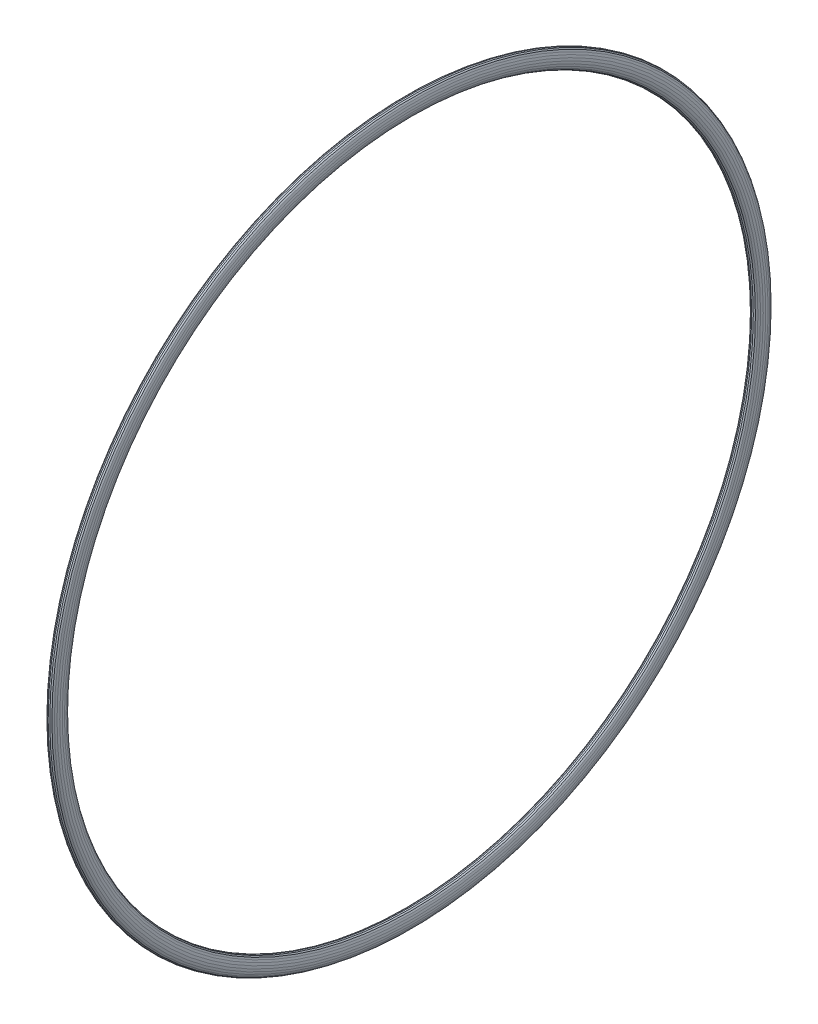
ISO-10303-21;
HEADER;
FILE_DESCRIPTION(('STEP AP214'),'2;1');
FILE_NAME('part.step','',(''),(''),'','','');
FILE_SCHEMA(('AUTOMOTIVE_DESIGN { 1 0 10303 214 1 1 1 1 }'));
ENDSEC;
DATA;
#1=APPLICATION_CONTEXT('core data for automotive mechanical design processes');
#2=APPLICATION_PROTOCOL_DEFINITION('international standard','automotive_design',2000,#1);
#3=PRODUCT_CONTEXT('',#1,'mechanical');
#4=PRODUCT('Part','Part','',(#3));
#5=PRODUCT_RELATED_PRODUCT_CATEGORY('part','',(#4));
#6=PRODUCT_DEFINITION_FORMATION('','',#4);
#7=PRODUCT_DEFINITION_CONTEXT('part definition',#1,'design');
#8=PRODUCT_DEFINITION('design','',#6,#7);
#9=PRODUCT_DEFINITION_SHAPE('','',#8);
#10=(LENGTH_UNIT() NAMED_UNIT(*) SI_UNIT(.MILLI.,.METRE.));
#11=(NAMED_UNIT(*) PLANE_ANGLE_UNIT() SI_UNIT($,.RADIAN.));
#12=(NAMED_UNIT(*) SI_UNIT($,.STERADIAN.) SOLID_ANGLE_UNIT());
#13=UNCERTAINTY_MEASURE_WITH_UNIT(LENGTH_MEASURE(1.E-05),#10,'distance_accuracy_value','');
#14=(GEOMETRIC_REPRESENTATION_CONTEXT(3) GLOBAL_UNCERTAINTY_ASSIGNED_CONTEXT((#13)) GLOBAL_UNIT_ASSIGNED_CONTEXT((#10,
#11,#12)) REPRESENTATION_CONTEXT('',''));
#15=CARTESIAN_POINT('',(0.,0.,0.));
#16=DIRECTION('',(0.,0.,1.));
#17=DIRECTION('',(1.,0.,0.));
#18=AXIS2_PLACEMENT_3D('',#15,#16,#17);
#19=CARTESIAN_POINT('',(-1.95500000000004,0.,0.));
#20=DIRECTION('',(-1.,0.,0.));
#21=DIRECTION('',(0.,0.,1.));
#22=AXIS2_PLACEMENT_3D('',#19,#20,#21);
#23=CONICAL_SURFACE('',#22,68.28,1.49799696442048);
#24=CARTESIAN_POINT('',(-1.92177768063184,0.,0.));
#25=DIRECTION('',(-1.,0.,0.));
#26=DIRECTION('',(0.,0.,1.));
#27=AXIS2_PLACEMENT_3D('',#24,#25,#26);
#28=CIRCLE('',#27,67.8244519350765);
#29=CARTESIAN_POINT('',(-1.92177768063184,0.,67.8244519350765));
#30=VERTEX_POINT('',#29);
#31=EDGE_CURVE('E113',#30,#30,#28,.T.);
#32=ORIENTED_EDGE('',*,*,#31,.F.);
#33=EDGE_LOOP('',(#32));
#34=FACE_BOUND('',#33,.T.);
#35=CARTESIAN_POINT('',(-1.95500000000004,0.,0.));
#36=DIRECTION('',(-1.,0.,0.));
#37=DIRECTION('',(0.,0.,1.));
#38=AXIS2_PLACEMENT_3D('',#35,#36,#37);
#39=CIRCLE('',#38,68.28);
#40=CARTESIAN_POINT('',(-1.95500000000004,0.,68.28));
#41=VERTEX_POINT('',#40);
#42=EDGE_CURVE('E10',#41,#41,#39,.T.);
#43=ORIENTED_EDGE('',*,*,#42,.T.);
#44=EDGE_LOOP('',(#43));
#45=FACE_BOUND('',#44,.T.);
#46=ADVANCED_FACE('F39',(#34,#45),#23,.F.);
#47=CARTESIAN_POINT('',(-1.92177768063184,0.,0.));
#48=DIRECTION('',(1.,0.,0.));
#49=DIRECTION('',(0.,0.,-1.));
#50=AXIS2_PLACEMENT_3D('',#47,#48,#49);
#51=CONICAL_SURFACE('',#50,68.7355480649235,1.49799696442048);
#52=ORIENTED_EDGE('',*,*,#42,.F.);
#53=EDGE_LOOP('',(#52));
#54=FACE_BOUND('',#53,.T.);
#55=CARTESIAN_POINT('',(-1.92177768063184,0.,0.));
#56=DIRECTION('',(-1.,0.,0.));
#57=DIRECTION('',(0.,0.,1.));
#58=AXIS2_PLACEMENT_3D('',#55,#56,#57);
#59=CIRCLE('',#58,68.7355480649235);
#60=CARTESIAN_POINT('',(-1.92177768063184,0.,68.7355480649235));
#61=VERTEX_POINT('',#60);
#62=EDGE_CURVE('E44',#61,#61,#59,.T.);
#63=ORIENTED_EDGE('',*,*,#62,.T.);
#64=EDGE_LOOP('',(#63));
#65=FACE_BOUND('',#64,.T.);
#66=ADVANCED_FACE('F125',(#54,#65),#51,.T.);
#67=CARTESIAN_POINT('',(-1.8243747686898,0.,0.));
#68=DIRECTION('',(1.,0.,0.));
#69=DIRECTION('',(0.,0.,-1.));
#70=AXIS2_PLACEMENT_3D('',#67,#68,#69);
#71=CONICAL_SURFACE('',#70,69.1600512820513,1.34524891644555);
#72=ORIENTED_EDGE('',*,*,#62,.F.);
#73=EDGE_LOOP('',(#72));
#74=FACE_BOUND('',#73,.T.);
#75=CARTESIAN_POINT('',(-1.8243747686898,0.,0.));
#76=DIRECTION('',(-1.,0.,0.));
#77=DIRECTION('',(0.,0.,1.));
#78=AXIS2_PLACEMENT_3D('',#75,#76,#77);
#79=CIRCLE('',#78,69.1600512820513);
#80=CARTESIAN_POINT('',(-1.8243747686898,0.,69.1600512820513));
#81=VERTEX_POINT('',#80);
#82=EDGE_CURVE('E47',#81,#81,#79,.T.);
#83=ORIENTED_EDGE('',*,*,#82,.T.);
#84=EDGE_LOOP('',(#83));
#85=FACE_BOUND('',#84,.T.);
#86=ADVANCED_FACE('F127',(#74,#85),#71,.T.);
#87=CARTESIAN_POINT('',(-1.66942911165691,0.,0.));
#88=DIRECTION('',(1.,0.,0.));
#89=DIRECTION('',(0.,0.,-1.));
#90=AXIS2_PLACEMENT_3D('',#87,#88,#89);
#91=CONICAL_SURFACE('',#90,69.5245804586608,1.16887745006469);
#92=ORIENTED_EDGE('',*,*,#82,.F.);
#93=EDGE_LOOP('',(#92));
#94=FACE_BOUND('',#93,.T.);
#95=CARTESIAN_POINT('',(-1.66942911165691,0.,0.));
#96=DIRECTION('',(-1.,0.,0.));
#97=DIRECTION('',(0.,0.,1.));
#98=AXIS2_PLACEMENT_3D('',#95,#96,#97);
#99=CIRCLE('',#98,69.5245804586608);
#100=CARTESIAN_POINT('',(-1.66942911165691,0.,69.5245804586608));
#101=VERTEX_POINT('',#100);
#102=EDGE_CURVE('E52',#101,#101,#99,.T.);
#103=ORIENTED_EDGE('',*,*,#102,.T.);
#104=EDGE_LOOP('',(#103));
#105=FACE_BOUND('',#104,.T.);
#106=ADVANCED_FACE('F132',(#94,#105),#91,.T.);
#107=CARTESIAN_POINT('',(-1.46749999999995,0.,0.));
#108=DIRECTION('',(1.,0.,0.));
#109=DIRECTION('',(0.,0.,-1.));
#110=AXIS2_PLACEMENT_3D('',#107,#108,#109);
#111=CONICAL_SURFACE('',#110,69.8042935337789,0.945513112154491);
#112=ORIENTED_EDGE('',*,*,#102,.F.);
#113=EDGE_LOOP('',(#112));
#114=FACE_BOUND('',#113,.T.);
#115=CARTESIAN_POINT('',(-1.46749999999995,0.,0.));
#116=DIRECTION('',(-1.,0.,0.));
#117=DIRECTION('',(0.,0.,1.));
#118=AXIS2_PLACEMENT_3D('',#115,#116,#117);
#119=CIRCLE('',#118,69.8042935337789);
#120=CARTESIAN_POINT('',(-1.46749999999995,0.,69.8042935337789));
#121=VERTEX_POINT('',#120);
#122=EDGE_CURVE('E59',#121,#121,#119,.T.);
#123=ORIENTED_EDGE('',*,*,#122,.T.);
#124=EDGE_LOOP('',(#123));
#125=FACE_BOUND('',#124,.T.);
#126=ADVANCED_FACE('F140',(#114,#125),#111,.T.);
#127=CARTESIAN_POINT('',(-1.23234856897492,0.,0.));
#128=DIRECTION('',(1.,0.,0.));
#129=DIRECTION('',(0.,0.,-1.));
#130=AXIS2_PLACEMENT_3D('',#127,#128,#129);
#131=CONICAL_SURFACE('',#130,69.9801285235843,0.642060936467532);
#132=ORIENTED_EDGE('',*,*,#122,.F.);
#133=EDGE_LOOP('',(#132));
#134=FACE_BOUND('',#133,.T.);
#135=CARTESIAN_POINT('',(-1.23234856897492,0.,0.));
#136=DIRECTION('',(-1.,0.,0.));
#137=DIRECTION('',(0.,0.,1.));
#138=AXIS2_PLACEMENT_3D('',#135,#136,#137);
#139=CIRCLE('',#138,69.9801285235843);
#140=CARTESIAN_POINT('',(-1.23234856897492,0.,69.9801285235843));
#141=VERTEX_POINT('',#140);
#142=EDGE_CURVE('E62',#141,#141,#139,.T.);
#143=ORIENTED_EDGE('',*,*,#142,.T.);
#144=EDGE_LOOP('',(#143));
#145=FACE_BOUND('',#144,.T.);
#146=ADVANCED_FACE('F143',(#134,#145),#131,.T.);
#147=CARTESIAN_POINT('',(-0.979999999999981,0.,0.));
#148=DIRECTION('',(1.,0.,0.));
#149=DIRECTION('',(0.,0.,-1.));
#150=AXIS2_PLACEMENT_3D('',#147,#148,#149);
#151=CONICAL_SURFACE('',#150,70.0401025641026,0.233334551441813);
#152=ORIENTED_EDGE('',*,*,#142,.F.);
#153=EDGE_LOOP('',(#152));
#154=FACE_BOUND('',#153,.T.);
#155=CARTESIAN_POINT('',(-0.979999999999981,0.,0.));
#156=DIRECTION('',(-1.,0.,0.));
#157=DIRECTION('',(0.,0.,1.));
#158=AXIS2_PLACEMENT_3D('',#155,#156,#157);
#159=CIRCLE('',#158,70.0401025641026);
#160=CARTESIAN_POINT('',(-0.979999999999981,0.,70.0401025641026));
#161=VERTEX_POINT('',#160);
#162=EDGE_CURVE('E61',#161,#161,#159,.T.);
#163=ORIENTED_EDGE('',*,*,#162,.T.);
#164=EDGE_LOOP('',(#163));
#165=FACE_BOUND('',#164,.T.);
#166=ADVANCED_FACE('F144',(#154,#165),#151,.T.);
#167=CARTESIAN_POINT('',(-0.727651431025045,0.,0.));
#168=DIRECTION('',(-1.,0.,0.));
#169=DIRECTION('',(0.,0.,1.));
#170=AXIS2_PLACEMENT_3D('',#167,#168,#169);
#171=CONICAL_SURFACE('',#170,69.9801285235843,0.233334551441813);
#172=ORIENTED_EDGE('',*,*,#162,.F.);
#173=EDGE_LOOP('',(#172));
#174=FACE_BOUND('',#173,.T.);
#175=CARTESIAN_POINT('',(-0.727651431025045,0.,0.));
#176=DIRECTION('',(-1.,0.,0.));
#177=DIRECTION('',(0.,0.,1.));
#178=AXIS2_PLACEMENT_3D('',#175,#176,#177);
#179=CIRCLE('',#178,69.9801285235843);
#180=CARTESIAN_POINT('',(-0.727651431025045,0.,69.9801285235843));
#181=VERTEX_POINT('',#180);
#182=EDGE_CURVE('E70',#181,#181,#179,.T.);
#183=ORIENTED_EDGE('',*,*,#182,.T.);
#184=EDGE_LOOP('',(#183));
#185=FACE_BOUND('',#184,.T.);
#186=ADVANCED_FACE('F149',(#174,#185),#171,.T.);
#187=CARTESIAN_POINT('',(-0.492500000000007,0.,0.));
#188=DIRECTION('',(-1.,0.,0.));
#189=DIRECTION('',(0.,0.,1.));
#190=AXIS2_PLACEMENT_3D('',#187,#188,#189);
#191=CONICAL_SURFACE('',#190,69.8042935337789,0.642060936467532);
#192=ORIENTED_EDGE('',*,*,#182,.F.);
#193=EDGE_LOOP('',(#192));
#194=FACE_BOUND('',#193,.T.);
#195=CARTESIAN_POINT('',(-0.492500000000007,0.,0.));
#196=DIRECTION('',(-1.,0.,0.));
#197=DIRECTION('',(0.,0.,1.));
#198=AXIS2_PLACEMENT_3D('',#195,#196,#197);
#199=CIRCLE('',#198,69.8042935337789);
#200=CARTESIAN_POINT('',(-0.492500000000007,0.,69.8042935337789));
#201=VERTEX_POINT('',#200);
#202=EDGE_CURVE('E68',#201,#201,#199,.T.);
#203=ORIENTED_EDGE('',*,*,#202,.T.);
#204=EDGE_LOOP('',(#203));
#205=FACE_BOUND('',#204,.T.);
#206=ADVANCED_FACE('F153',(#194,#205),#191,.T.);
#207=CARTESIAN_POINT('',(-0.290570888343167,0.,0.));
#208=DIRECTION('',(-1.,0.,0.));
#209=DIRECTION('',(0.,0.,1.));
#210=AXIS2_PLACEMENT_3D('',#207,#208,#209);
#211=CONICAL_SURFACE('',#210,69.5245804586608,0.945513112154752);
#212=ORIENTED_EDGE('',*,*,#202,.F.);
#213=EDGE_LOOP('',(#212));
#214=FACE_BOUND('',#213,.T.);
#215=CARTESIAN_POINT('',(-0.290570888343167,0.,0.));
#216=DIRECTION('',(-1.,0.,0.));
#217=DIRECTION('',(0.,0.,1.));
#218=AXIS2_PLACEMENT_3D('',#215,#216,#217);
#219=CIRCLE('',#218,69.5245804586608);
#220=CARTESIAN_POINT('',(-0.290570888343167,0.,69.5245804586608));
#221=VERTEX_POINT('',#220);
#222=EDGE_CURVE('E71',#221,#221,#219,.T.);
#223=ORIENTED_EDGE('',*,*,#222,.T.);
#224=EDGE_LOOP('',(#223));
#225=FACE_BOUND('',#224,.T.);
#226=ADVANCED_FACE('F160',(#214,#225),#211,.T.);
#227=CARTESIAN_POINT('',(-0.135625231310166,0.,0.));
#228=DIRECTION('',(-1.,0.,0.));
#229=DIRECTION('',(0.,0.,1.));
#230=AXIS2_PLACEMENT_3D('',#227,#228,#229);
#231=CONICAL_SURFACE('',#230,69.1600512820513,1.16887745006443);
#232=ORIENTED_EDGE('',*,*,#222,.F.);
#233=EDGE_LOOP('',(#232));
#234=FACE_BOUND('',#233,.T.);
#235=CARTESIAN_POINT('',(-0.135625231310166,0.,0.));
#236=DIRECTION('',(-1.,0.,0.));
#237=DIRECTION('',(0.,0.,1.));
#238=AXIS2_PLACEMENT_3D('',#235,#236,#237);
#239=CIRCLE('',#238,69.1600512820513);
#240=CARTESIAN_POINT('',(-0.135625231310166,0.,69.1600512820513));
#241=VERTEX_POINT('',#240);
#242=EDGE_CURVE('E77',#241,#241,#239,.T.);
#243=ORIENTED_EDGE('',*,*,#242,.T.);
#244=EDGE_LOOP('',(#243));
#245=FACE_BOUND('',#244,.T.);
#246=ADVANCED_FACE('F161',(#234,#245),#231,.T.);
#247=CARTESIAN_POINT('',(-0.0382223193681197,0.,0.));
#248=DIRECTION('',(-1.,0.,0.));
#249=DIRECTION('',(0.,0.,1.));
#250=AXIS2_PLACEMENT_3D('',#247,#248,#249);
#251=CONICAL_SURFACE('',#250,68.7355480649235,1.34524891644555);
#252=ORIENTED_EDGE('',*,*,#242,.F.);
#253=EDGE_LOOP('',(#252));
#254=FACE_BOUND('',#253,.T.);
#255=CARTESIAN_POINT('',(-0.0382223193681197,0.,0.));
#256=DIRECTION('',(-1.,0.,0.));
#257=DIRECTION('',(0.,0.,1.));
#258=AXIS2_PLACEMENT_3D('',#255,#256,#257);
#259=CIRCLE('',#258,68.7355480649235);
#260=CARTESIAN_POINT('',(-0.0382223193681197,0.,68.7355480649235));
#261=VERTEX_POINT('',#260);
#262=EDGE_CURVE('E76',#261,#261,#259,.T.);
#263=ORIENTED_EDGE('',*,*,#262,.T.);
#264=EDGE_LOOP('',(#263));
#265=FACE_BOUND('',#264,.T.);
#266=ADVANCED_FACE('F164',(#254,#265),#251,.T.);
#267=CARTESIAN_POINT('',(-0.00500000000003276,0.,0.));
#268=DIRECTION('',(-1.,0.,0.));
#269=DIRECTION('',(0.,0.,1.));
#270=AXIS2_PLACEMENT_3D('',#267,#268,#269);
#271=CONICAL_SURFACE('',#270,68.28,1.49799696442072);
#272=ORIENTED_EDGE('',*,*,#262,.F.);
#273=EDGE_LOOP('',(#272));
#274=FACE_BOUND('',#273,.T.);
#275=CARTESIAN_POINT('',(-0.00500000000003276,0.,0.));
#276=DIRECTION('',(-1.,0.,0.));
#277=DIRECTION('',(0.,0.,1.));
#278=AXIS2_PLACEMENT_3D('',#275,#276,#277);
#279=CIRCLE('',#278,68.28);
#280=CARTESIAN_POINT('',(-0.00500000000003276,0.,68.28));
#281=VERTEX_POINT('',#280);
#282=EDGE_CURVE('E85',#281,#281,#279,.T.);
#283=ORIENTED_EDGE('',*,*,#282,.T.);
#284=EDGE_LOOP('',(#283));
#285=FACE_BOUND('',#284,.T.);
#286=ADVANCED_FACE('F166',(#274,#285),#271,.T.);
#287=CARTESIAN_POINT('',(-0.0382223193681197,0.,0.));
#288=DIRECTION('',(1.,0.,0.));
#289=DIRECTION('',(0.,0.,-1.));
#290=AXIS2_PLACEMENT_3D('',#287,#288,#289);
#291=CONICAL_SURFACE('',#290,67.8244519350765,1.49799696442072);
#292=ORIENTED_EDGE('',*,*,#282,.F.);
#293=EDGE_LOOP('',(#292));
#294=FACE_BOUND('',#293,.T.);
#295=CARTESIAN_POINT('',(-0.0382223193681197,0.,0.));
#296=DIRECTION('',(-1.,0.,0.));
#297=DIRECTION('',(0.,0.,1.));
#298=AXIS2_PLACEMENT_3D('',#295,#296,#297);
#299=CIRCLE('',#298,67.8244519350765);
#300=CARTESIAN_POINT('',(-0.0382223193681197,0.,67.8244519350765));
#301=VERTEX_POINT('',#300);
#302=EDGE_CURVE('E83',#301,#301,#299,.T.);
#303=ORIENTED_EDGE('',*,*,#302,.T.);
#304=EDGE_LOOP('',(#303));
#305=FACE_BOUND('',#304,.T.);
#306=ADVANCED_FACE('F174',(#294,#305),#291,.F.);
#307=CARTESIAN_POINT('',(-0.135625231310166,0.,0.));
#308=DIRECTION('',(1.,0.,0.));
#309=DIRECTION('',(0.,0.,-1.));
#310=AXIS2_PLACEMENT_3D('',#307,#308,#309);
#311=CONICAL_SURFACE('',#310,67.3999487179487,1.34524891644555);
#312=ORIENTED_EDGE('',*,*,#302,.F.);
#313=EDGE_LOOP('',(#312));
#314=FACE_BOUND('',#313,.T.);
#315=CARTESIAN_POINT('',(-0.135625231310166,0.,0.));
#316=DIRECTION('',(-1.,0.,0.));
#317=DIRECTION('',(0.,0.,1.));
#318=AXIS2_PLACEMENT_3D('',#315,#316,#317);
#319=CIRCLE('',#318,67.3999487179487);
#320=CARTESIAN_POINT('',(-0.135625231310166,0.,67.3999487179487));
#321=VERTEX_POINT('',#320);
#322=EDGE_CURVE('E86',#321,#321,#319,.T.);
#323=ORIENTED_EDGE('',*,*,#322,.T.);
#324=EDGE_LOOP('',(#323));
#325=FACE_BOUND('',#324,.T.);
#326=ADVANCED_FACE('F180',(#314,#325),#311,.F.);
#327=CARTESIAN_POINT('',(-0.290570888343167,0.,0.));
#328=DIRECTION('',(1.,0.,0.));
#329=DIRECTION('',(0.,0.,-1.));
#330=AXIS2_PLACEMENT_3D('',#327,#328,#329);
#331=CONICAL_SURFACE('',#330,67.0354195413393,1.16887745006443);
#332=ORIENTED_EDGE('',*,*,#322,.F.);
#333=EDGE_LOOP('',(#332));
#334=FACE_BOUND('',#333,.T.);
#335=CARTESIAN_POINT('',(-0.290570888343167,0.,0.));
#336=DIRECTION('',(-1.,0.,0.));
#337=DIRECTION('',(0.,0.,1.));
#338=AXIS2_PLACEMENT_3D('',#335,#336,#337);
#339=CIRCLE('',#338,67.0354195413393);
#340=CARTESIAN_POINT('',(-0.290570888343167,0.,67.0354195413393));
#341=VERTEX_POINT('',#340);
#342=EDGE_CURVE('E93',#341,#341,#339,.T.);
#343=ORIENTED_EDGE('',*,*,#342,.T.);
#344=EDGE_LOOP('',(#343));
#345=FACE_BOUND('',#344,.T.);
#346=ADVANCED_FACE('F182',(#334,#345),#331,.F.);
#347=CARTESIAN_POINT('',(-0.492500000000007,0.,0.));
#348=DIRECTION('',(1.,0.,0.));
#349=DIRECTION('',(0.,0.,-1.));
#350=AXIS2_PLACEMENT_3D('',#347,#348,#349);
#351=CONICAL_SURFACE('',#350,66.7557064662211,0.945513112154752);
#352=ORIENTED_EDGE('',*,*,#342,.F.);
#353=EDGE_LOOP('',(#352));
#354=FACE_BOUND('',#353,.T.);
#355=CARTESIAN_POINT('',(-0.492500000000007,0.,0.));
#356=DIRECTION('',(-1.,0.,0.));
#357=DIRECTION('',(0.,0.,1.));
#358=AXIS2_PLACEMENT_3D('',#355,#356,#357);
#359=CIRCLE('',#358,66.7557064662211);
#360=CARTESIAN_POINT('',(-0.492500000000007,0.,66.7557064662211));
#361=VERTEX_POINT('',#360);
#362=EDGE_CURVE('E94',#361,#361,#359,.T.);
#363=ORIENTED_EDGE('',*,*,#362,.T.);
#364=EDGE_LOOP('',(#363));
#365=FACE_BOUND('',#364,.T.);
#366=ADVANCED_FACE('F183',(#354,#365),#351,.F.);
#367=CARTESIAN_POINT('',(-0.727651431025045,0.,0.));
#368=DIRECTION('',(1.,0.,0.));
#369=DIRECTION('',(0.,0.,-1.));
#370=AXIS2_PLACEMENT_3D('',#367,#368,#369);
#371=CONICAL_SURFACE('',#370,66.5798714764157,0.642060936467495);
#372=ORIENTED_EDGE('',*,*,#362,.F.);
#373=EDGE_LOOP('',(#372));
#374=FACE_BOUND('',#373,.T.);
#375=CARTESIAN_POINT('',(-0.727651431025045,0.,0.));
#376=DIRECTION('',(-1.,0.,0.));
#377=DIRECTION('',(0.,0.,1.));
#378=AXIS2_PLACEMENT_3D('',#375,#376,#377);
#379=CIRCLE('',#378,66.5798714764157);
#380=CARTESIAN_POINT('',(-0.727651431025045,0.,66.5798714764157));
#381=VERTEX_POINT('',#380);
#382=EDGE_CURVE('E100',#381,#381,#379,.T.);
#383=ORIENTED_EDGE('',*,*,#382,.T.);
#384=EDGE_LOOP('',(#383));
#385=FACE_BOUND('',#384,.T.);
#386=ADVANCED_FACE('F186',(#374,#385),#371,.F.);
#387=CARTESIAN_POINT('',(-0.979999999999981,0.,0.));
#388=DIRECTION('',(1.,0.,0.));
#389=DIRECTION('',(0.,0.,-1.));
#390=AXIS2_PLACEMENT_3D('',#387,#388,#389);
#391=CONICAL_SURFACE('',#390,66.5198974358974,0.233334551441865);
#392=ORIENTED_EDGE('',*,*,#382,.F.);
#393=EDGE_LOOP('',(#392));
#394=FACE_BOUND('',#393,.T.);
#395=CARTESIAN_POINT('',(-0.979999999999981,0.,0.));
#396=DIRECTION('',(-1.,0.,0.));
#397=DIRECTION('',(0.,0.,1.));
#398=AXIS2_PLACEMENT_3D('',#395,#396,#397);
#399=CIRCLE('',#398,66.5198974358974);
#400=CARTESIAN_POINT('',(-0.979999999999981,0.,66.5198974358974));
#401=VERTEX_POINT('',#400);
#402=EDGE_CURVE('E99',#401,#401,#399,.T.);
#403=ORIENTED_EDGE('',*,*,#402,.T.);
#404=EDGE_LOOP('',(#403));
#405=FACE_BOUND('',#404,.T.);
#406=ADVANCED_FACE('F194',(#394,#405),#391,.F.);
#407=CARTESIAN_POINT('',(-1.23234856897492,0.,0.));
#408=DIRECTION('',(-1.,0.,0.));
#409=DIRECTION('',(0.,0.,1.));
#410=AXIS2_PLACEMENT_3D('',#407,#408,#409);
#411=CONICAL_SURFACE('',#410,66.5798714764157,0.233334551441865);
#412=ORIENTED_EDGE('',*,*,#402,.F.);
#413=EDGE_LOOP('',(#412));
#414=FACE_BOUND('',#413,.T.);
#415=CARTESIAN_POINT('',(-1.23234856897492,0.,0.));
#416=DIRECTION('',(-1.,0.,0.));
#417=DIRECTION('',(0.,0.,1.));
#418=AXIS2_PLACEMENT_3D('',#415,#416,#417);
#419=CIRCLE('',#418,66.5798714764157);
#420=CARTESIAN_POINT('',(-1.23234856897492,0.,66.5798714764157));
#421=VERTEX_POINT('',#420);
#422=EDGE_CURVE('E103',#421,#421,#419,.T.);
#423=ORIENTED_EDGE('',*,*,#422,.T.);
#424=EDGE_LOOP('',(#423));
#425=FACE_BOUND('',#424,.T.);
#426=ADVANCED_FACE('F197',(#414,#425),#411,.F.);
#427=CARTESIAN_POINT('',(-1.46749999999995,0.,0.));
#428=DIRECTION('',(-1.,0.,0.));
#429=DIRECTION('',(0.,0.,1.));
#430=AXIS2_PLACEMENT_3D('',#427,#428,#429);
#431=CONICAL_SURFACE('',#430,66.7557064662211,0.642060936467495);
#432=ORIENTED_EDGE('',*,*,#422,.F.);
#433=EDGE_LOOP('',(#432));
#434=FACE_BOUND('',#433,.T.);
#435=CARTESIAN_POINT('',(-1.46749999999995,0.,0.));
#436=DIRECTION('',(-1.,0.,0.));
#437=DIRECTION('',(0.,0.,1.));
#438=AXIS2_PLACEMENT_3D('',#435,#436,#437);
#439=CIRCLE('',#438,66.7557064662211);
#440=CARTESIAN_POINT('',(-1.46749999999995,0.,66.7557064662211));
#441=VERTEX_POINT('',#440);
#442=EDGE_CURVE('E106',#441,#441,#439,.T.);
#443=ORIENTED_EDGE('',*,*,#442,.T.);
#444=EDGE_LOOP('',(#443));
#445=FACE_BOUND('',#444,.T.);
#446=ADVANCED_FACE('F203',(#434,#445),#431,.F.);
#447=CARTESIAN_POINT('',(-1.66942911165691,0.,0.));
#448=DIRECTION('',(-1.,0.,0.));
#449=DIRECTION('',(0.,0.,1.));
#450=AXIS2_PLACEMENT_3D('',#447,#448,#449);
#451=CONICAL_SURFACE('',#450,67.0354195413393,0.945513112154491);
#452=ORIENTED_EDGE('',*,*,#442,.F.);
#453=EDGE_LOOP('',(#452));
#454=FACE_BOUND('',#453,.T.);
#455=CARTESIAN_POINT('',(-1.66942911165691,0.,0.));
#456=DIRECTION('',(-1.,0.,0.));
#457=DIRECTION('',(0.,0.,1.));
#458=AXIS2_PLACEMENT_3D('',#455,#456,#457);
#459=CIRCLE('',#458,67.0354195413393);
#460=CARTESIAN_POINT('',(-1.66942911165691,0.,67.0354195413393));
#461=VERTEX_POINT('',#460);
#462=EDGE_CURVE('E108',#461,#461,#459,.T.);
#463=ORIENTED_EDGE('',*,*,#462,.T.);
#464=EDGE_LOOP('',(#463));
#465=FACE_BOUND('',#464,.T.);
#466=ADVANCED_FACE('F202',(#454,#465),#451,.F.);
#467=CARTESIAN_POINT('',(-1.8243747686898,0.,0.));
#468=DIRECTION('',(-1.,0.,0.));
#469=DIRECTION('',(0.,0.,1.));
#470=AXIS2_PLACEMENT_3D('',#467,#468,#469);
#471=CONICAL_SURFACE('',#470,67.3999487179487,1.16887745006469);
#472=ORIENTED_EDGE('',*,*,#462,.F.);
#473=EDGE_LOOP('',(#472));
#474=FACE_BOUND('',#473,.T.);
#475=CARTESIAN_POINT('',(-1.8243747686898,0.,0.));
#476=DIRECTION('',(-1.,0.,0.));
#477=DIRECTION('',(0.,0.,1.));
#478=AXIS2_PLACEMENT_3D('',#475,#476,#477);
#479=CIRCLE('',#478,67.3999487179487);
#480=CARTESIAN_POINT('',(-1.8243747686898,0.,67.3999487179487));
#481=VERTEX_POINT('',#480);
#482=EDGE_CURVE('E115',#481,#481,#479,.T.);
#483=ORIENTED_EDGE('',*,*,#482,.T.);
#484=EDGE_LOOP('',(#483));
#485=FACE_BOUND('',#484,.T.);
#486=ADVANCED_FACE('F207',(#474,#485),#471,.F.);
#487=CARTESIAN_POINT('',(-1.92177768063184,0.,0.));
#488=DIRECTION('',(-1.,0.,0.));
#489=DIRECTION('',(0.,0.,1.));
#490=AXIS2_PLACEMENT_3D('',#487,#488,#489);
#491=CONICAL_SURFACE('',#490,67.8244519350765,1.34524891644555);
#492=ORIENTED_EDGE('',*,*,#482,.F.);
#493=EDGE_LOOP('',(#492));
#494=FACE_BOUND('',#493,.T.);
#495=ORIENTED_EDGE('',*,*,#31,.T.);
#496=EDGE_LOOP('',(#495));
#497=FACE_BOUND('',#496,.T.);
#498=ADVANCED_FACE('F116',(#494,#497),#491,.F.);
#499=CLOSED_SHELL('',(#46,#66,#86,#106,#126,#146,#166,#186,#206,#226,#246,#266,#286,#306,#326,
#346,#366,#386,#406,#426,#446,#466,#486,#498));
#500=MANIFOLD_SOLID_BREP('B2',#499);
#501=ADVANCED_BREP_SHAPE_REPRESENTATION('',(#18,#500),#14);
#502=SHAPE_DEFINITION_REPRESENTATION(#9,#501);
ENDSEC;
END-ISO-10303-21;
